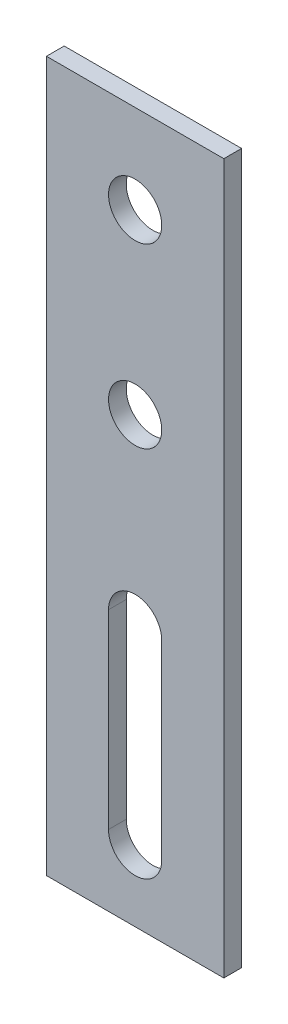
ISO-10303-21;
HEADER;
FILE_DESCRIPTION(('STEP AP214'),'2;1');
FILE_NAME('part.step','',(''),(''),'','','');
FILE_SCHEMA(('AUTOMOTIVE_DESIGN { 1 0 10303 214 1 1 1 1 }'));
ENDSEC;
DATA;
#1=APPLICATION_CONTEXT('core data for automotive mechanical design processes');
#2=APPLICATION_PROTOCOL_DEFINITION('international standard','automotive_design',2000,#1);
#3=PRODUCT_CONTEXT('',#1,'mechanical');
#4=PRODUCT('Part','Part','',(#3));
#5=PRODUCT_RELATED_PRODUCT_CATEGORY('part','',(#4));
#6=PRODUCT_DEFINITION_FORMATION('','',#4);
#7=PRODUCT_DEFINITION_CONTEXT('part definition',#1,'design');
#8=PRODUCT_DEFINITION('design','',#6,#7);
#9=PRODUCT_DEFINITION_SHAPE('','',#8);
#10=(LENGTH_UNIT() NAMED_UNIT(*) SI_UNIT(.MILLI.,.METRE.));
#11=(NAMED_UNIT(*) PLANE_ANGLE_UNIT() SI_UNIT($,.RADIAN.));
#12=(NAMED_UNIT(*) SI_UNIT($,.STERADIAN.) SOLID_ANGLE_UNIT());
#13=UNCERTAINTY_MEASURE_WITH_UNIT(LENGTH_MEASURE(1.E-05),#10,'distance_accuracy_value','');
#14=(GEOMETRIC_REPRESENTATION_CONTEXT(3) GLOBAL_UNCERTAINTY_ASSIGNED_CONTEXT((#13)) GLOBAL_UNIT_ASSIGNED_CONTEXT((#10,
#11,#12)) REPRESENTATION_CONTEXT('',''));
#15=CARTESIAN_POINT('',(0.,0.,0.));
#16=DIRECTION('',(0.,0.,1.));
#17=DIRECTION('',(1.,0.,0.));
#18=AXIS2_PLACEMENT_3D('',#15,#16,#17);
#19=CARTESIAN_POINT('',(0.,0.,2.));
#20=DIRECTION('',(0.,0.,1.));
#21=DIRECTION('',(1.,0.,0.));
#22=AXIS2_PLACEMENT_3D('',#19,#20,#21);
#23=PLANE('',#22);
#24=CARTESIAN_POINT('',(-3.35893535921931,37.816091954023,2.));
#25=DIRECTION('',(0.,0.,1.));
#26=DIRECTION('',(1.,0.,0.));
#27=AXIS2_PLACEMENT_3D('',#24,#25,#26);
#28=CIRCLE('',#27,3.);
#29=CARTESIAN_POINT('',(-0.358935359219302,37.816091954023,2.));
#30=VERTEX_POINT('',#29);
#31=EDGE_CURVE('E140',#30,#30,#28,.T.);
#32=ORIENTED_EDGE('',*,*,#31,.F.);
#33=EDGE_LOOP('',(#32));
#34=FACE_BOUND('',#33,.T.);
#35=DIRECTION('',(0.,-1.,0.));
#36=VECTOR('',#35,1.);
#37=CARTESIAN_POINT('',(-13.3589353592193,47.816091954023,2.));
#38=LINE('',#37,#36);
#39=CARTESIAN_POINT('',(-13.3589353592193,47.816091954023,2.));
#40=VERTEX_POINT('',#39);
#41=CARTESIAN_POINT('',(-13.3589353592193,-32.183908045977,2.));
#42=VERTEX_POINT('',#41);
#43=EDGE_CURVE('E146',#40,#42,#38,.T.);
#44=ORIENTED_EDGE('',*,*,#43,.T.);
#45=DIRECTION('',(1.,0.,0.));
#46=VECTOR('',#45,1.);
#47=CARTESIAN_POINT('',(-13.3589353592193,-32.183908045977,2.));
#48=LINE('',#47,#46);
#49=CARTESIAN_POINT('',(6.64106464078071,-32.183908045977,2.));
#50=VERTEX_POINT('',#49);
#51=EDGE_CURVE('E149',#42,#50,#48,.T.);
#52=ORIENTED_EDGE('',*,*,#51,.T.);
#53=DIRECTION('',(0.,1.,0.));
#54=VECTOR('',#53,1.);
#55=CARTESIAN_POINT('',(6.64106464078069,47.816091954023,2.));
#56=LINE('',#55,#54);
#57=CARTESIAN_POINT('',(6.64106464078069,47.816091954023,2.));
#58=VERTEX_POINT('',#57);
#59=EDGE_CURVE('E152',#50,#58,#56,.T.);
#60=ORIENTED_EDGE('',*,*,#59,.T.);
#61=DIRECTION('',(-1.,0.,0.));
#62=VECTOR('',#61,1.);
#63=CARTESIAN_POINT('',(-13.3589353592193,47.816091954023,2.));
#64=LINE('',#63,#62);
#65=EDGE_CURVE('E154',#58,#40,#64,.T.);
#66=ORIENTED_EDGE('',*,*,#65,.T.);
#67=EDGE_LOOP('',(#44,#52,#60,#66));
#68=FACE_BOUND('',#67,.T.);
#69=CARTESIAN_POINT('',(-3.3589353592193,17.816091954023,2.));
#70=DIRECTION('',(0.,0.,1.));
#71=DIRECTION('',(1.,0.,0.));
#72=AXIS2_PLACEMENT_3D('',#69,#70,#71);
#73=CIRCLE('',#72,3.);
#74=CARTESIAN_POINT('',(-0.358935359219305,17.816091954023,2.));
#75=VERTEX_POINT('',#74);
#76=EDGE_CURVE('E134',#75,#75,#73,.T.);
#77=ORIENTED_EDGE('',*,*,#76,.F.);
#78=EDGE_LOOP('',(#77));
#79=FACE_BOUND('',#78,.T.);
#80=DIRECTION('',(0.,1.,0.));
#81=VECTOR('',#80,1.);
#82=CARTESIAN_POINT('',(-0.358935359219303,-24.183908045977,2.));
#83=LINE('',#82,#81);
#84=CARTESIAN_POINT('',(-0.358935359219303,-24.183908045977,2.));
#85=VERTEX_POINT('',#84);
#86=CARTESIAN_POINT('',(-0.358935359219304,-2.72265104400752,2.));
#87=VERTEX_POINT('',#86);
#88=EDGE_CURVE('E106',#85,#87,#83,.T.);
#89=ORIENTED_EDGE('',*,*,#88,.F.);
#90=CARTESIAN_POINT('',(-3.35893535921931,-24.183908045977,2.));
#91=DIRECTION('',(0.,0.,1.));
#92=DIRECTION('',(1.,0.,0.));
#93=AXIS2_PLACEMENT_3D('',#90,#91,#92);
#94=CIRCLE('',#93,3.);
#95=CARTESIAN_POINT('',(-6.35893535921931,-24.183908045977,2.));
#96=VERTEX_POINT('',#95);
#97=EDGE_CURVE('E98',#96,#85,#94,.T.);
#98=ORIENTED_EDGE('',*,*,#97,.F.);
#99=DIRECTION('',(0.,-1.,0.));
#100=VECTOR('',#99,1.);
#101=CARTESIAN_POINT('',(-6.35893535921931,-24.183908045977,2.));
#102=LINE('',#101,#100);
#103=CARTESIAN_POINT('',(-6.35893535921931,-2.72265104400752,2.));
#104=VERTEX_POINT('',#103);
#105=EDGE_CURVE('E120',#104,#96,#102,.T.);
#106=ORIENTED_EDGE('',*,*,#105,.F.);
#107=CARTESIAN_POINT('',(-3.3589353592193,-2.72265104400752,2.));
#108=DIRECTION('',(0.,0.,1.));
#109=DIRECTION('',(1.,0.,0.));
#110=AXIS2_PLACEMENT_3D('',#107,#108,#109);
#111=CIRCLE('',#110,3.);
#112=EDGE_CURVE('E118',#87,#104,#111,.T.);
#113=ORIENTED_EDGE('',*,*,#112,.F.);
#114=EDGE_LOOP('',(#89,#98,#106,#113));
#115=FACE_BOUND('',#114,.T.);
#116=ADVANCED_FACE('F33',(#34,#68,#79,#115),#23,.T.);
#117=CARTESIAN_POINT('',(0.,0.,0.));
#118=DIRECTION('',(0.,0.,1.));
#119=DIRECTION('',(1.,0.,0.));
#120=AXIS2_PLACEMENT_3D('',#117,#118,#119);
#121=PLANE('',#120);
#122=CARTESIAN_POINT('',(-3.3589353592193,17.816091954023,0.));
#123=DIRECTION('',(0.,0.,1.));
#124=DIRECTION('',(1.,0.,0.));
#125=AXIS2_PLACEMENT_3D('',#122,#123,#124);
#126=CIRCLE('',#125,3.);
#127=CARTESIAN_POINT('',(-0.358935359219305,17.816091954023,0.));
#128=VERTEX_POINT('',#127);
#129=EDGE_CURVE('E114',#128,#128,#126,.T.);
#130=ORIENTED_EDGE('',*,*,#129,.T.);
#131=EDGE_LOOP('',(#130));
#132=FACE_BOUND('',#131,.T.);
#133=CARTESIAN_POINT('',(-3.35893535921931,37.816091954023,0.));
#134=DIRECTION('',(0.,0.,1.));
#135=DIRECTION('',(1.,0.,0.));
#136=AXIS2_PLACEMENT_3D('',#133,#134,#135);
#137=CIRCLE('',#136,3.);
#138=CARTESIAN_POINT('',(-0.358935359219302,37.816091954023,0.));
#139=VERTEX_POINT('',#138);
#140=EDGE_CURVE('E137',#139,#139,#137,.T.);
#141=ORIENTED_EDGE('',*,*,#140,.T.);
#142=EDGE_LOOP('',(#141));
#143=FACE_BOUND('',#142,.T.);
#144=DIRECTION('',(0.,-1.,0.));
#145=VECTOR('',#144,1.);
#146=CARTESIAN_POINT('',(-13.3589353592193,47.816091954023,0.));
#147=LINE('',#146,#145);
#148=CARTESIAN_POINT('',(-13.3589353592193,47.816091954023,0.));
#149=VERTEX_POINT('',#148);
#150=CARTESIAN_POINT('',(-13.3589353592193,-32.183908045977,0.));
#151=VERTEX_POINT('',#150);
#152=EDGE_CURVE('E143',#149,#151,#147,.T.);
#153=ORIENTED_EDGE('',*,*,#152,.F.);
#154=DIRECTION('',(-1.,0.,0.));
#155=VECTOR('',#154,1.);
#156=CARTESIAN_POINT('',(-13.3589353592193,47.816091954023,0.));
#157=LINE('',#156,#155);
#158=CARTESIAN_POINT('',(6.64106464078069,47.816091954023,0.));
#159=VERTEX_POINT('',#158);
#160=EDGE_CURVE('E150',#159,#149,#157,.T.);
#161=ORIENTED_EDGE('',*,*,#160,.F.);
#162=DIRECTION('',(0.,1.,0.));
#163=VECTOR('',#162,1.);
#164=CARTESIAN_POINT('',(6.64106464078069,47.816091954023,0.));
#165=LINE('',#164,#163);
#166=CARTESIAN_POINT('',(6.64106464078071,-32.183908045977,0.));
#167=VERTEX_POINT('',#166);
#168=EDGE_CURVE('E161',#167,#159,#165,.T.);
#169=ORIENTED_EDGE('',*,*,#168,.F.);
#170=DIRECTION('',(1.,0.,0.));
#171=VECTOR('',#170,1.);
#172=CARTESIAN_POINT('',(-13.3589353592193,-32.183908045977,0.));
#173=LINE('',#172,#171);
#174=EDGE_CURVE('E159',#151,#167,#173,.T.);
#175=ORIENTED_EDGE('',*,*,#174,.F.);
#176=EDGE_LOOP('',(#153,#161,#169,#175));
#177=FACE_BOUND('',#176,.T.);
#178=CARTESIAN_POINT('',(-3.35893535921931,-24.183908045977,0.));
#179=DIRECTION('',(0.,0.,1.));
#180=DIRECTION('',(1.,0.,0.));
#181=AXIS2_PLACEMENT_3D('',#178,#179,#180);
#182=CIRCLE('',#181,3.);
#183=CARTESIAN_POINT('',(-6.35893535921931,-24.183908045977,0.));
#184=VERTEX_POINT('',#183);
#185=CARTESIAN_POINT('',(-0.358935359219303,-24.183908045977,0.));
#186=VERTEX_POINT('',#185);
#187=EDGE_CURVE('E56',#184,#186,#182,.T.);
#188=ORIENTED_EDGE('',*,*,#187,.T.);
#189=DIRECTION('',(0.,1.,0.));
#190=VECTOR('',#189,1.);
#191=CARTESIAN_POINT('',(-0.358935359219303,-24.183908045977,0.));
#192=LINE('',#191,#190);
#193=CARTESIAN_POINT('',(-0.358935359219304,-2.72265104400752,0.));
#194=VERTEX_POINT('',#193);
#195=EDGE_CURVE('E113',#186,#194,#192,.T.);
#196=ORIENTED_EDGE('',*,*,#195,.T.);
#197=CARTESIAN_POINT('',(-3.3589353592193,-2.72265104400752,0.));
#198=DIRECTION('',(0.,0.,1.));
#199=DIRECTION('',(1.,0.,0.));
#200=AXIS2_PLACEMENT_3D('',#197,#198,#199);
#201=CIRCLE('',#200,3.);
#202=CARTESIAN_POINT('',(-6.35893535921931,-2.72265104400752,0.));
#203=VERTEX_POINT('',#202);
#204=EDGE_CURVE('E126',#194,#203,#201,.T.);
#205=ORIENTED_EDGE('',*,*,#204,.T.);
#206=DIRECTION('',(0.,-1.,0.));
#207=VECTOR('',#206,1.);
#208=CARTESIAN_POINT('',(-6.35893535921931,-24.183908045977,0.));
#209=LINE('',#208,#207);
#210=EDGE_CURVE('E107',#203,#184,#209,.T.);
#211=ORIENTED_EDGE('',*,*,#210,.T.);
#212=EDGE_LOOP('',(#188,#196,#205,#211));
#213=FACE_BOUND('',#212,.T.);
#214=ADVANCED_FACE('F179',(#132,#143,#177,#213),#121,.F.);
#215=CARTESIAN_POINT('',(-13.3589353592193,47.816091954023,2.));
#216=DIRECTION('',(1.,0.,0.));
#217=DIRECTION('',(0.,1.,0.));
#218=AXIS2_PLACEMENT_3D('',#215,#216,#217);
#219=PLANE('',#218);
#220=ORIENTED_EDGE('',*,*,#152,.T.);
#221=DIRECTION('',(0.,0.,-1.));
#222=VECTOR('',#221,1.);
#223=CARTESIAN_POINT('',(-13.3589353592193,-32.183908045977,2.));
#224=LINE('',#223,#222);
#225=EDGE_CURVE('E11',#42,#151,#224,.T.);
#226=ORIENTED_EDGE('',*,*,#225,.F.);
#227=ORIENTED_EDGE('',*,*,#43,.F.);
#228=DIRECTION('',(0.,0.,-1.));
#229=VECTOR('',#228,1.);
#230=CARTESIAN_POINT('',(-13.3589353592193,47.816091954023,2.));
#231=LINE('',#230,#229);
#232=EDGE_CURVE('E156',#40,#149,#231,.T.);
#233=ORIENTED_EDGE('',*,*,#232,.T.);
#234=EDGE_LOOP('',(#220,#226,#227,#233));
#235=FACE_BOUND('',#234,.T.);
#236=ADVANCED_FACE('F35',(#235),#219,.F.);
#237=CARTESIAN_POINT('',(-13.3589353592193,-32.183908045977,2.));
#238=DIRECTION('',(0.,1.,0.));
#239=DIRECTION('',(0.,0.,1.));
#240=AXIS2_PLACEMENT_3D('',#237,#238,#239);
#241=PLANE('',#240);
#242=ORIENTED_EDGE('',*,*,#174,.T.);
#243=DIRECTION('',(0.,0.,-1.));
#244=VECTOR('',#243,1.);
#245=CARTESIAN_POINT('',(6.64106464078071,-32.183908045977,2.));
#246=LINE('',#245,#244);
#247=EDGE_CURVE('E41',#50,#167,#246,.T.);
#248=ORIENTED_EDGE('',*,*,#247,.F.);
#249=ORIENTED_EDGE('',*,*,#51,.F.);
#250=ORIENTED_EDGE('',*,*,#225,.T.);
#251=EDGE_LOOP('',(#242,#248,#249,#250));
#252=FACE_BOUND('',#251,.T.);
#253=ADVANCED_FACE('F190',(#252),#241,.F.);
#254=CARTESIAN_POINT('',(6.64106464078069,47.816091954023,2.));
#255=DIRECTION('',(-1.,0.,0.));
#256=DIRECTION('',(0.,-1.,0.));
#257=AXIS2_PLACEMENT_3D('',#254,#255,#256);
#258=PLANE('',#257);
#259=ORIENTED_EDGE('',*,*,#168,.T.);
#260=DIRECTION('',(0.,0.,-1.));
#261=VECTOR('',#260,1.);
#262=CARTESIAN_POINT('',(6.64106464078069,47.816091954023,2.));
#263=LINE('',#262,#261);
#264=EDGE_CURVE('E166',#58,#159,#263,.T.);
#265=ORIENTED_EDGE('',*,*,#264,.F.);
#266=ORIENTED_EDGE('',*,*,#59,.F.);
#267=ORIENTED_EDGE('',*,*,#247,.T.);
#268=EDGE_LOOP('',(#259,#265,#266,#267));
#269=FACE_BOUND('',#268,.T.);
#270=ADVANCED_FACE('F173',(#269),#258,.F.);
#271=CARTESIAN_POINT('',(-13.3589353592193,47.816091954023,2.));
#272=DIRECTION('',(0.,-1.,0.));
#273=DIRECTION('',(0.,0.,-1.));
#274=AXIS2_PLACEMENT_3D('',#271,#272,#273);
#275=PLANE('',#274);
#276=ORIENTED_EDGE('',*,*,#160,.T.);
#277=ORIENTED_EDGE('',*,*,#232,.F.);
#278=ORIENTED_EDGE('',*,*,#65,.F.);
#279=ORIENTED_EDGE('',*,*,#264,.T.);
#280=EDGE_LOOP('',(#276,#277,#278,#279));
#281=FACE_BOUND('',#280,.T.);
#282=ADVANCED_FACE('F183',(#281),#275,.F.);
#283=CARTESIAN_POINT('',(-3.35893535921931,37.816091954023,2.));
#284=DIRECTION('',(0.,0.,-1.));
#285=DIRECTION('',(-1.,0.,0.));
#286=AXIS2_PLACEMENT_3D('',#283,#284,#285);
#287=CYLINDRICAL_SURFACE('',#286,3.);
#288=ORIENTED_EDGE('',*,*,#31,.T.);
#289=EDGE_LOOP('',(#288));
#290=FACE_BOUND('',#289,.T.);
#291=ORIENTED_EDGE('',*,*,#140,.F.);
#292=EDGE_LOOP('',(#291));
#293=FACE_BOUND('',#292,.T.);
#294=ADVANCED_FACE('F207',(#290,#293),#287,.F.);
#295=CARTESIAN_POINT('',(-3.3589353592193,17.816091954023,2.));
#296=DIRECTION('',(0.,0.,-1.));
#297=DIRECTION('',(-1.,0.,0.));
#298=AXIS2_PLACEMENT_3D('',#295,#296,#297);
#299=CYLINDRICAL_SURFACE('',#298,3.);
#300=ORIENTED_EDGE('',*,*,#76,.T.);
#301=EDGE_LOOP('',(#300));
#302=FACE_BOUND('',#301,.T.);
#303=ORIENTED_EDGE('',*,*,#129,.F.);
#304=EDGE_LOOP('',(#303));
#305=FACE_BOUND('',#304,.T.);
#306=ADVANCED_FACE('F214',(#302,#305),#299,.F.);
#307=CARTESIAN_POINT('',(-3.35893535921931,-24.183908045977,2.));
#308=DIRECTION('',(0.,0.,-1.));
#309=DIRECTION('',(-1.,0.,0.));
#310=AXIS2_PLACEMENT_3D('',#307,#308,#309);
#311=CYLINDRICAL_SURFACE('',#310,3.);
#312=ORIENTED_EDGE('',*,*,#187,.F.);
#313=DIRECTION('',(0.,0.,-1.));
#314=VECTOR('',#313,1.);
#315=CARTESIAN_POINT('',(-6.35893535921931,-24.183908045977,2.));
#316=LINE('',#315,#314);
#317=EDGE_CURVE('E102',#96,#184,#316,.T.);
#318=ORIENTED_EDGE('',*,*,#317,.F.);
#319=ORIENTED_EDGE('',*,*,#97,.T.);
#320=DIRECTION('',(0.,0.,-1.));
#321=VECTOR('',#320,1.);
#322=CARTESIAN_POINT('',(-0.358935359219303,-24.183908045977,2.));
#323=LINE('',#322,#321);
#324=EDGE_CURVE('E101',#85,#186,#323,.T.);
#325=ORIENTED_EDGE('',*,*,#324,.T.);
#326=EDGE_LOOP('',(#312,#318,#319,#325));
#327=FACE_BOUND('',#326,.T.);
#328=ADVANCED_FACE('F100',(#327),#311,.F.);
#329=CARTESIAN_POINT('',(-0.358935359219303,-24.183908045977,2.));
#330=DIRECTION('',(-1.,0.,0.));
#331=DIRECTION('',(0.,-1.,0.));
#332=AXIS2_PLACEMENT_3D('',#329,#330,#331);
#333=PLANE('',#332);
#334=ORIENTED_EDGE('',*,*,#195,.F.);
#335=ORIENTED_EDGE('',*,*,#324,.F.);
#336=ORIENTED_EDGE('',*,*,#88,.T.);
#337=DIRECTION('',(0.,0.,-1.));
#338=VECTOR('',#337,1.);
#339=CARTESIAN_POINT('',(-0.358935359219304,-2.72265104400752,2.));
#340=LINE('',#339,#338);
#341=EDGE_CURVE('E115',#87,#194,#340,.T.);
#342=ORIENTED_EDGE('',*,*,#341,.T.);
#343=EDGE_LOOP('',(#334,#335,#336,#342));
#344=FACE_BOUND('',#343,.T.);
#345=ADVANCED_FACE('F110',(#344),#333,.T.);
#346=CARTESIAN_POINT('',(-3.3589353592193,-2.72265104400752,2.));
#347=DIRECTION('',(0.,0.,-1.));
#348=DIRECTION('',(-1.,0.,0.));
#349=AXIS2_PLACEMENT_3D('',#346,#347,#348);
#350=CYLINDRICAL_SURFACE('',#349,3.);
#351=ORIENTED_EDGE('',*,*,#204,.F.);
#352=ORIENTED_EDGE('',*,*,#341,.F.);
#353=ORIENTED_EDGE('',*,*,#112,.T.);
#354=DIRECTION('',(0.,0.,-1.));
#355=VECTOR('',#354,1.);
#356=CARTESIAN_POINT('',(-6.35893535921931,-2.72265104400752,2.));
#357=LINE('',#356,#355);
#358=EDGE_CURVE('E48',#104,#203,#357,.T.);
#359=ORIENTED_EDGE('',*,*,#358,.T.);
#360=EDGE_LOOP('',(#351,#352,#353,#359));
#361=FACE_BOUND('',#360,.T.);
#362=ADVANCED_FACE('F231',(#361),#350,.F.);
#363=CARTESIAN_POINT('',(-6.35893535921931,-24.183908045977,2.));
#364=DIRECTION('',(1.,0.,0.));
#365=DIRECTION('',(0.,1.,0.));
#366=AXIS2_PLACEMENT_3D('',#363,#364,#365);
#367=PLANE('',#366);
#368=ORIENTED_EDGE('',*,*,#210,.F.);
#369=ORIENTED_EDGE('',*,*,#358,.F.);
#370=ORIENTED_EDGE('',*,*,#105,.T.);
#371=ORIENTED_EDGE('',*,*,#317,.T.);
#372=EDGE_LOOP('',(#368,#369,#370,#371));
#373=FACE_BOUND('',#372,.T.);
#374=ADVANCED_FACE('F234',(#373),#367,.T.);
#375=CLOSED_SHELL('',(#116,#214,#236,#253,#270,#282,#294,#306,#328,#345,#362,#374));
#376=MANIFOLD_SOLID_BREP('B2',#375);
#377=ADVANCED_BREP_SHAPE_REPRESENTATION('',(#18,#376),#14);
#378=SHAPE_DEFINITION_REPRESENTATION(#9,#377);
ENDSEC;
END-ISO-10303-21;
